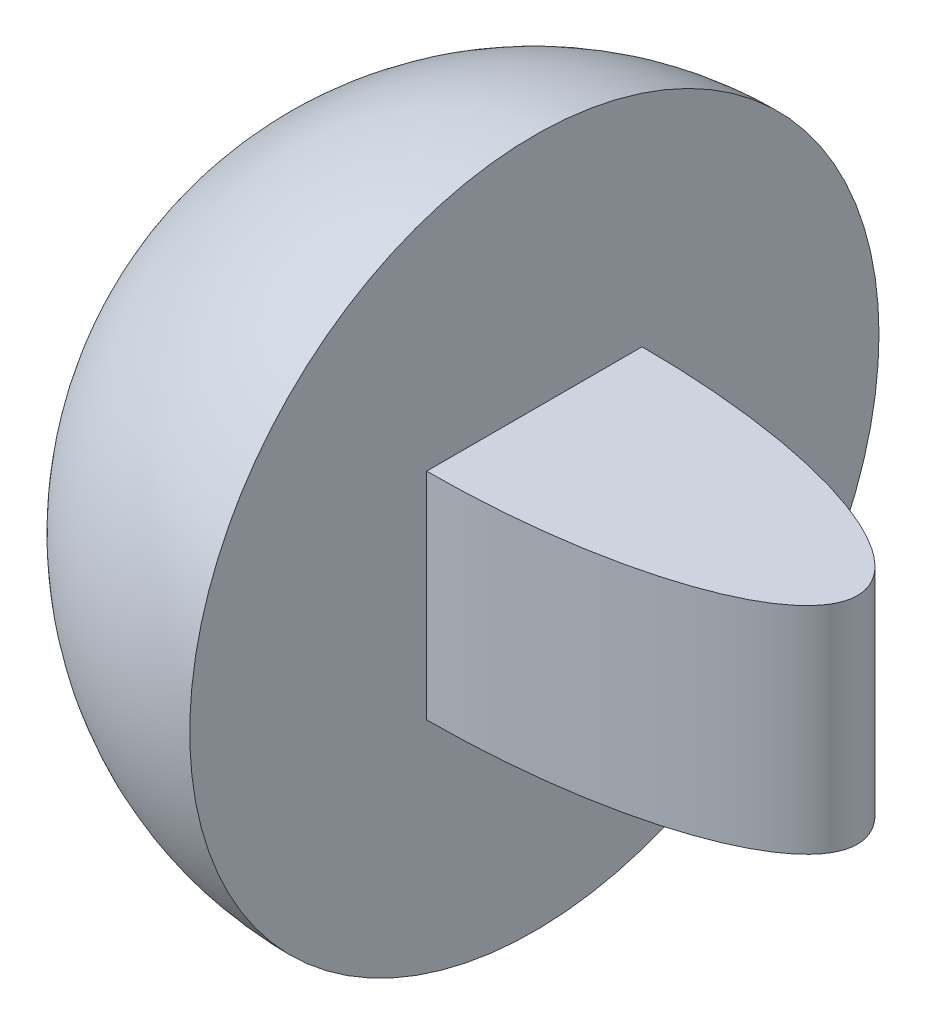
ISO-10303-21;
HEADER;
FILE_DESCRIPTION(('STEP AP214'),'2;1');
FILE_NAME('part.step','',(''),(''),'','','');
FILE_SCHEMA(('AUTOMOTIVE_DESIGN { 1 0 10303 214 1 1 1 1 }'));
ENDSEC;
DATA;
#1=APPLICATION_CONTEXT('core data for automotive mechanical design processes');
#2=APPLICATION_PROTOCOL_DEFINITION('international standard','automotive_design',2000,#1);
#3=PRODUCT_CONTEXT('',#1,'mechanical');
#4=PRODUCT('Part','Part','',(#3));
#5=PRODUCT_RELATED_PRODUCT_CATEGORY('part','',(#4));
#6=PRODUCT_DEFINITION_FORMATION('','',#4);
#7=PRODUCT_DEFINITION_CONTEXT('part definition',#1,'design');
#8=PRODUCT_DEFINITION('design','',#6,#7);
#9=PRODUCT_DEFINITION_SHAPE('','',#8);
#10=(LENGTH_UNIT() NAMED_UNIT(*) SI_UNIT(.MILLI.,.METRE.));
#11=(NAMED_UNIT(*) PLANE_ANGLE_UNIT() SI_UNIT($,.RADIAN.));
#12=(NAMED_UNIT(*) SI_UNIT($,.STERADIAN.) SOLID_ANGLE_UNIT());
#13=UNCERTAINTY_MEASURE_WITH_UNIT(LENGTH_MEASURE(1.E-05),#10,'distance_accuracy_value','');
#14=(GEOMETRIC_REPRESENTATION_CONTEXT(3) GLOBAL_UNCERTAINTY_ASSIGNED_CONTEXT((#13)) GLOBAL_UNIT_ASSIGNED_CONTEXT((#10,
#11,#12)) REPRESENTATION_CONTEXT('',''));
#15=CARTESIAN_POINT('',(0.,0.,0.));
#16=DIRECTION('',(0.,0.,1.));
#17=DIRECTION('',(1.,0.,0.));
#18=AXIS2_PLACEMENT_3D('',#15,#16,#17);
#19=CARTESIAN_POINT('',(0.,-25.,0.));
#20=DIRECTION('',(0.,1.,0.));
#21=DIRECTION('',(1.,0.,0.));
#22=AXIS2_PLACEMENT_3D('',#19,#20,#21);
#23=ELLIPSE('',#22,75.,25.);
#24=DIRECTION('',(0.,1.,0.));
#25=VECTOR('',#24,1.);
#26=SURFACE_OF_LINEAR_EXTRUSION('',#23,#25);
#27=DIRECTION('',(0.,1.,0.));
#28=VECTOR('',#27,1.);
#29=CARTESIAN_POINT('',(0.,-25.,-25.));
#30=LINE('',#29,#28);
#31=CARTESIAN_POINT('',(0.,25.,-25.));
#32=VERTEX_POINT('',#31);
#33=CARTESIAN_POINT('',(0.,-25.,-25.));
#34=VERTEX_POINT('',#33);
#35=EDGE_CURVE('E88',#32,#34,#30,.F.);
#36=ORIENTED_EDGE('',*,*,#35,.F.);
#37=CARTESIAN_POINT('',(0.,25.,0.));
#38=DIRECTION('',(0.,1.,0.));
#39=DIRECTION('',(1.,0.,0.));
#40=AXIS2_PLACEMENT_3D('',#37,#38,#39);
#41=ELLIPSE('',#40,75.,25.);
#42=CARTESIAN_POINT('',(0.,25.,25.));
#43=VERTEX_POINT('',#42);
#44=EDGE_CURVE('E98',#43,#32,#41,.T.);
#45=ORIENTED_EDGE('',*,*,#44,.F.);
#46=DIRECTION('',(0.,1.,0.));
#47=VECTOR('',#46,1.);
#48=CARTESIAN_POINT('',(0.,-25.,25.));
#49=LINE('',#48,#47);
#50=CARTESIAN_POINT('',(0.,-25.,25.));
#51=VERTEX_POINT('',#50);
#52=EDGE_CURVE('E60',#51,#43,#49,.T.);
#53=ORIENTED_EDGE('',*,*,#52,.F.);
#54=EDGE_CURVE('E53',#51,#34,#23,.T.);
#55=ORIENTED_EDGE('',*,*,#54,.T.);
#56=EDGE_LOOP('',(#36,#45,#53,#55));
#57=FACE_BOUND('',#56,.T.);
#58=ADVANCED_FACE('F45',(#57),#26,.T.);
#59=CARTESIAN_POINT('',(0.,-25.,0.));
#60=DIRECTION('',(0.,1.,0.));
#61=DIRECTION('',(0.,0.,1.));
#62=AXIS2_PLACEMENT_3D('',#59,#60,#61);
#63=PLANE('',#62);
#64=ORIENTED_EDGE('',*,*,#54,.F.);
#65=DIRECTION('',(0.,0.,-1.));
#66=VECTOR('',#65,1.);
#67=CARTESIAN_POINT('',(0.,-25.,0.));
#68=LINE('',#67,#66);
#69=EDGE_CURVE('E66',#51,#34,#68,.T.);
#70=ORIENTED_EDGE('',*,*,#69,.T.);
#71=EDGE_LOOP('',(#64,#70));
#72=FACE_BOUND('',#71,.T.);
#73=ADVANCED_FACE('F107',(#72),#63,.F.);
#74=CARTESIAN_POINT('',(0.,25.,0.));
#75=DIRECTION('',(0.,1.,0.));
#76=DIRECTION('',(0.,0.,1.));
#77=AXIS2_PLACEMENT_3D('',#74,#75,#76);
#78=PLANE('',#77);
#79=DIRECTION('',(0.,0.,-1.));
#80=VECTOR('',#79,1.);
#81=CARTESIAN_POINT('',(0.,25.,0.));
#82=LINE('',#81,#80);
#83=EDGE_CURVE('E11',#43,#32,#82,.T.);
#84=ORIENTED_EDGE('',*,*,#83,.F.);
#85=ORIENTED_EDGE('',*,*,#44,.T.);
#86=EDGE_LOOP('',(#84,#85));
#87=FACE_BOUND('',#86,.T.);
#88=ADVANCED_FACE('F105',(#87),#78,.T.);
#89=CARTESIAN_POINT('',(0.,0.,0.));
#90=DIRECTION('',(1.,0.,0.));
#91=DIRECTION('',(0.,0.,-1.));
#92=AXIS2_PLACEMENT_3D('',#89,#90,#91);
#93=PLANE('',#92);
#94=CARTESIAN_POINT('',(0.,0.,0.));
#95=DIRECTION('',(1.,0.,0.));
#96=DIRECTION('',(0.,0.,-1.));
#97=AXIS2_PLACEMENT_3D('',#94,#95,#96);
#98=CIRCLE('',#97,80.);
#99=CARTESIAN_POINT('',(0.,0.,-80.));
#100=VERTEX_POINT('',#99);
#101=EDGE_CURVE('E83',#100,#100,#98,.T.);
#102=ORIENTED_EDGE('',*,*,#101,.T.);
#103=EDGE_LOOP('',(#102));
#104=FACE_BOUND('',#103,.T.);
#105=ORIENTED_EDGE('',*,*,#69,.F.);
#106=ORIENTED_EDGE('',*,*,#52,.T.);
#107=ORIENTED_EDGE('',*,*,#83,.T.);
#108=ORIENTED_EDGE('',*,*,#35,.T.);
#109=EDGE_LOOP('',(#105,#106,#107,#108));
#110=FACE_BOUND('',#109,.T.);
#111=ADVANCED_FACE('F79',(#104,#110),#93,.T.);
#112=CARTESIAN_POINT('',(0.,0.,0.));
#113=DIRECTION('',(0.,1.,0.));
#114=DIRECTION('',(0.,0.,-1.));
#115=AXIS2_PLACEMENT_3D('',#112,#113,#114);
#116=ELLIPSE('',#115,80.,80.);
#117=TRIMMED_CURVE('',#116,(PARAMETER_VALUE(-1.5707963267949)),
(PARAMETER_VALUE(1.5707963267949)),.T.,.PARAMETER.);
#118=CARTESIAN_POINT('',(0.,0.,0.));
#119=DIRECTION('',(1.,0.,0.));
#120=AXIS1_PLACEMENT('',#118,#119);
#121=SURFACE_OF_REVOLUTION('',#117,#120);
#122=CARTESIAN_POINT('',(-80.,0.,0.));
#123=VERTEX_POINT('',#122);
#124=VERTEX_LOOP('',#123);
#125=FACE_BOUND('',#124,.T.);
#126=ORIENTED_EDGE('',*,*,#101,.F.);
#127=EDGE_LOOP('',(#126));
#128=FACE_BOUND('',#127,.T.);
#129=ADVANCED_FACE('F76',(#125,#128),#121,.F.);
#130=CLOSED_SHELL('',(#58,#73,#88,#111,#129));
#131=MANIFOLD_SOLID_BREP('B2',#130);
#132=ADVANCED_BREP_SHAPE_REPRESENTATION('',(#18,#131),#14);
#133=SHAPE_DEFINITION_REPRESENTATION(#9,#132);
ENDSEC;
END-ISO-10303-21;
